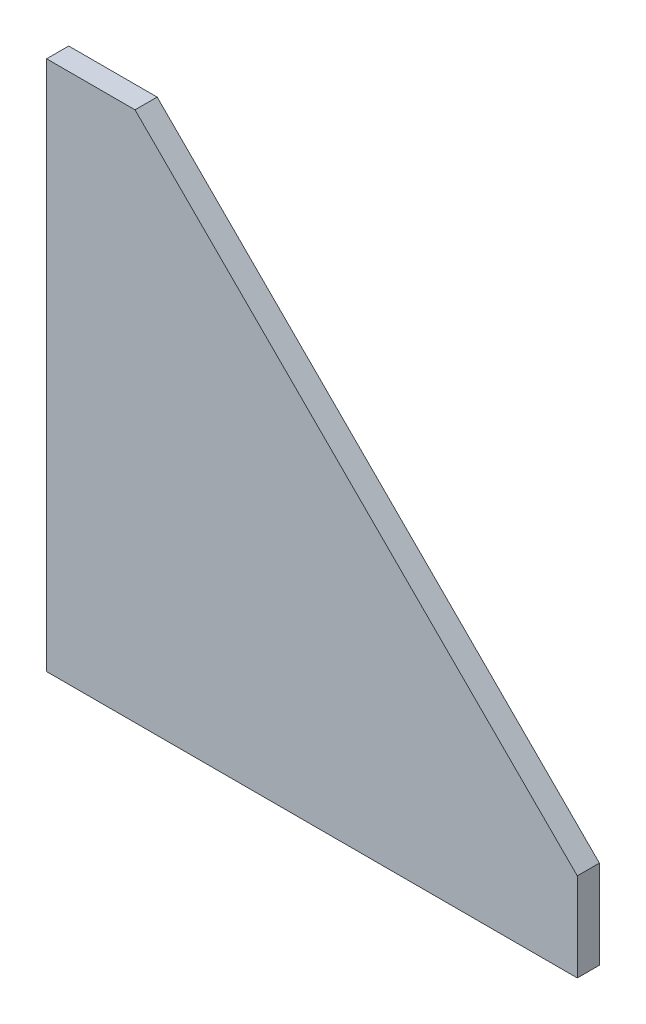
ISO-10303-21;
HEADER;
FILE_DESCRIPTION(('STEP AP214'),'2;1');
FILE_NAME('part.step','',(''),(''),'','','');
FILE_SCHEMA(('AUTOMOTIVE_DESIGN { 1 0 10303 214 1 1 1 1 }'));
ENDSEC;
DATA;
#1=APPLICATION_CONTEXT('core data for automotive mechanical design processes');
#2=APPLICATION_PROTOCOL_DEFINITION('international standard','automotive_design',2000,#1);
#3=PRODUCT_CONTEXT('',#1,'mechanical');
#4=PRODUCT('Part','Part','',(#3));
#5=PRODUCT_RELATED_PRODUCT_CATEGORY('part','',(#4));
#6=PRODUCT_DEFINITION_FORMATION('','',#4);
#7=PRODUCT_DEFINITION_CONTEXT('part definition',#1,'design');
#8=PRODUCT_DEFINITION('design','',#6,#7);
#9=PRODUCT_DEFINITION_SHAPE('','',#8);
#10=(LENGTH_UNIT() NAMED_UNIT(*) SI_UNIT(.MILLI.,.METRE.));
#11=(NAMED_UNIT(*) PLANE_ANGLE_UNIT() SI_UNIT($,.RADIAN.));
#12=(NAMED_UNIT(*) SI_UNIT($,.STERADIAN.) SOLID_ANGLE_UNIT());
#13=UNCERTAINTY_MEASURE_WITH_UNIT(LENGTH_MEASURE(1.E-05),#10,'distance_accuracy_value','');
#14=(GEOMETRIC_REPRESENTATION_CONTEXT(3) GLOBAL_UNCERTAINTY_ASSIGNED_CONTEXT((#13)) GLOBAL_UNIT_ASSIGNED_CONTEXT((#10,
#11,#12)) REPRESENTATION_CONTEXT('',''));
#15=CARTESIAN_POINT('',(0.,0.,0.));
#16=DIRECTION('',(0.,0.,1.));
#17=DIRECTION('',(1.,0.,0.));
#18=AXIS2_PLACEMENT_3D('',#15,#16,#17);
#19=CARTESIAN_POINT('',(304.8,0.,12.7));
#20=DIRECTION('',(0.,1.,0.));
#21=DIRECTION('',(-1.,0.,0.));
#22=AXIS2_PLACEMENT_3D('',#19,#20,#21);
#23=PLANE('',#22);
#24=DIRECTION('',(1.,0.,0.));
#25=VECTOR('',#24,1.);
#26=CARTESIAN_POINT('',(304.8,0.,0.));
#27=LINE('',#26,#25);
#28=CARTESIAN_POINT('',(0.,0.,0.));
#29=VERTEX_POINT('',#28);
#30=CARTESIAN_POINT('',(304.8,0.,0.));
#31=VERTEX_POINT('',#30);
#32=EDGE_CURVE('E107',#29,#31,#27,.T.);
#33=ORIENTED_EDGE('',*,*,#32,.T.);
#34=DIRECTION('',(0.,0.,-1.));
#35=VECTOR('',#34,1.);
#36=CARTESIAN_POINT('',(304.8,0.,12.7));
#37=LINE('',#36,#35);
#38=CARTESIAN_POINT('',(304.8,0.,12.7));
#39=VERTEX_POINT('',#38);
#40=EDGE_CURVE('E11',#39,#31,#37,.T.);
#41=ORIENTED_EDGE('',*,*,#40,.F.);
#42=DIRECTION('',(1.,0.,0.));
#43=VECTOR('',#42,1.);
#44=CARTESIAN_POINT('',(304.8,0.,12.7));
#45=LINE('',#44,#43);
#46=CARTESIAN_POINT('',(0.,0.,12.7));
#47=VERTEX_POINT('',#46);
#48=EDGE_CURVE('E115',#47,#39,#45,.T.);
#49=ORIENTED_EDGE('',*,*,#48,.F.);
#50=DIRECTION('',(0.,0.,-1.));
#51=VECTOR('',#50,1.);
#52=CARTESIAN_POINT('',(0.,0.,12.7));
#53=LINE('',#52,#51);
#54=EDGE_CURVE('E103',#47,#29,#53,.T.);
#55=ORIENTED_EDGE('',*,*,#54,.T.);
#56=EDGE_LOOP('',(#33,#41,#49,#55));
#57=FACE_BOUND('',#56,.T.);
#58=ADVANCED_FACE('F33',(#57),#23,.F.);
#59=CARTESIAN_POINT('',(304.8,50.8,12.7));
#60=DIRECTION('',(-1.,0.,0.));
#61=DIRECTION('',(0.,0.,1.));
#62=AXIS2_PLACEMENT_3D('',#59,#60,#61);
#63=PLANE('',#62);
#64=DIRECTION('',(0.,1.,0.));
#65=VECTOR('',#64,1.);
#66=CARTESIAN_POINT('',(304.8,50.8,0.));
#67=LINE('',#66,#65);
#68=CARTESIAN_POINT('',(304.8,50.8,0.));
#69=VERTEX_POINT('',#68);
#70=EDGE_CURVE('E110',#31,#69,#67,.T.);
#71=ORIENTED_EDGE('',*,*,#70,.T.);
#72=DIRECTION('',(0.,0.,-1.));
#73=VECTOR('',#72,1.);
#74=CARTESIAN_POINT('',(304.8,50.8,12.7));
#75=LINE('',#74,#73);
#76=CARTESIAN_POINT('',(304.8,50.8,12.7));
#77=VERTEX_POINT('',#76);
#78=EDGE_CURVE('E41',#77,#69,#75,.T.);
#79=ORIENTED_EDGE('',*,*,#78,.F.);
#80=DIRECTION('',(0.,1.,0.));
#81=VECTOR('',#80,1.);
#82=CARTESIAN_POINT('',(304.8,50.8,12.7));
#83=LINE('',#82,#81);
#84=EDGE_CURVE('E83',#39,#77,#83,.T.);
#85=ORIENTED_EDGE('',*,*,#84,.F.);
#86=ORIENTED_EDGE('',*,*,#40,.T.);
#87=EDGE_LOOP('',(#71,#79,#85,#86));
#88=FACE_BOUND('',#87,.T.);
#89=ADVANCED_FACE('F134',(#88),#63,.F.);
#90=CARTESIAN_POINT('',(50.8,304.8,12.7));
#91=DIRECTION('',(-0.707106781186548,-0.707106781186548,0.));
#92=DIRECTION('',(0.707106781186548,-0.707106781186548,0.));
#93=AXIS2_PLACEMENT_3D('',#90,#91,#92);
#94=PLANE('',#93);
#95=DIRECTION('',(-0.707106781186547,0.707106781186547,0.));
#96=VECTOR('',#95,1.);
#97=CARTESIAN_POINT('',(50.8,304.8,0.));
#98=LINE('',#97,#96);
#99=CARTESIAN_POINT('',(50.8,304.8,0.));
#100=VERTEX_POINT('',#99);
#101=EDGE_CURVE('E98',#69,#100,#98,.T.);
#102=ORIENTED_EDGE('',*,*,#101,.T.);
#103=DIRECTION('',(0.,0.,-1.));
#104=VECTOR('',#103,1.);
#105=CARTESIAN_POINT('',(50.8,304.8,12.7));
#106=LINE('',#105,#104);
#107=CARTESIAN_POINT('',(50.8,304.8,12.7));
#108=VERTEX_POINT('',#107);
#109=EDGE_CURVE('E95',#108,#100,#106,.T.);
#110=ORIENTED_EDGE('',*,*,#109,.F.);
#111=DIRECTION('',(-0.707106781186547,0.707106781186547,0.));
#112=VECTOR('',#111,1.);
#113=CARTESIAN_POINT('',(50.8,304.8,12.7));
#114=LINE('',#113,#112);
#115=EDGE_CURVE('E87',#77,#108,#114,.T.);
#116=ORIENTED_EDGE('',*,*,#115,.F.);
#117=ORIENTED_EDGE('',*,*,#78,.T.);
#118=EDGE_LOOP('',(#102,#110,#116,#117));
#119=FACE_BOUND('',#118,.T.);
#120=ADVANCED_FACE('F96',(#119),#94,.F.);
#121=CARTESIAN_POINT('',(0.,304.8,12.7));
#122=DIRECTION('',(0.,-1.,0.));
#123=DIRECTION('',(0.,0.,-1.));
#124=AXIS2_PLACEMENT_3D('',#121,#122,#123);
#125=PLANE('',#124);
#126=DIRECTION('',(-1.,0.,0.));
#127=VECTOR('',#126,1.);
#128=CARTESIAN_POINT('',(0.,304.8,0.));
#129=LINE('',#128,#127);
#130=CARTESIAN_POINT('',(0.,304.8,0.));
#131=VERTEX_POINT('',#130);
#132=EDGE_CURVE('E69',#100,#131,#129,.T.);
#133=ORIENTED_EDGE('',*,*,#132,.T.);
#134=DIRECTION('',(0.,0.,-1.));
#135=VECTOR('',#134,1.);
#136=CARTESIAN_POINT('',(0.,304.8,12.7));
#137=LINE('',#136,#135);
#138=CARTESIAN_POINT('',(0.,304.8,12.7));
#139=VERTEX_POINT('',#138);
#140=EDGE_CURVE('E99',#139,#131,#137,.T.);
#141=ORIENTED_EDGE('',*,*,#140,.F.);
#142=DIRECTION('',(-1.,0.,0.));
#143=VECTOR('',#142,1.);
#144=CARTESIAN_POINT('',(0.,304.8,12.7));
#145=LINE('',#144,#143);
#146=EDGE_CURVE('E91',#108,#139,#145,.T.);
#147=ORIENTED_EDGE('',*,*,#146,.F.);
#148=ORIENTED_EDGE('',*,*,#109,.T.);
#149=EDGE_LOOP('',(#133,#141,#147,#148));
#150=FACE_BOUND('',#149,.T.);
#151=ADVANCED_FACE('F101',(#150),#125,.F.);
#152=CARTESIAN_POINT('',(0.,0.,12.7));
#153=DIRECTION('',(1.,0.,0.));
#154=DIRECTION('',(0.,0.,-1.));
#155=AXIS2_PLACEMENT_3D('',#152,#153,#154);
#156=PLANE('',#155);
#157=DIRECTION('',(0.,-1.,0.));
#158=VECTOR('',#157,1.);
#159=CARTESIAN_POINT('',(0.,0.,0.));
#160=LINE('',#159,#158);
#161=EDGE_CURVE('E75',#131,#29,#160,.T.);
#162=ORIENTED_EDGE('',*,*,#161,.T.);
#163=ORIENTED_EDGE('',*,*,#54,.F.);
#164=DIRECTION('',(0.,-1.,0.));
#165=VECTOR('',#164,1.);
#166=CARTESIAN_POINT('',(0.,0.,12.7));
#167=LINE('',#166,#165);
#168=EDGE_CURVE('E49',#139,#47,#167,.T.);
#169=ORIENTED_EDGE('',*,*,#168,.F.);
#170=ORIENTED_EDGE('',*,*,#140,.T.);
#171=EDGE_LOOP('',(#162,#163,#169,#170));
#172=FACE_BOUND('',#171,.T.);
#173=ADVANCED_FACE('F123',(#172),#156,.F.);
#174=CARTESIAN_POINT('',(0.,0.,12.7));
#175=DIRECTION('',(0.,0.,-1.));
#176=DIRECTION('',(-1.,0.,0.));
#177=AXIS2_PLACEMENT_3D('',#174,#175,#176);
#178=PLANE('',#177);
#179=ORIENTED_EDGE('',*,*,#48,.T.);
#180=ORIENTED_EDGE('',*,*,#84,.T.);
#181=ORIENTED_EDGE('',*,*,#115,.T.);
#182=ORIENTED_EDGE('',*,*,#146,.T.);
#183=ORIENTED_EDGE('',*,*,#168,.T.);
#184=EDGE_LOOP('',(#179,#180,#181,#182,#183));
#185=FACE_BOUND('',#184,.T.);
#186=ADVANCED_FACE('F89',(#185),#178,.F.);
#187=CARTESIAN_POINT('',(0.,0.,0.));
#188=DIRECTION('',(0.,0.,-1.));
#189=DIRECTION('',(-1.,0.,0.));
#190=AXIS2_PLACEMENT_3D('',#187,#188,#189);
#191=PLANE('',#190);
#192=ORIENTED_EDGE('',*,*,#32,.F.);
#193=ORIENTED_EDGE('',*,*,#161,.F.);
#194=ORIENTED_EDGE('',*,*,#132,.F.);
#195=ORIENTED_EDGE('',*,*,#101,.F.);
#196=ORIENTED_EDGE('',*,*,#70,.F.);
#197=EDGE_LOOP('',(#192,#193,#194,#195,#196));
#198=FACE_BOUND('',#197,.T.);
#199=ADVANCED_FACE('F119',(#198),#191,.T.);
#200=CLOSED_SHELL('',(#58,#89,#120,#151,#173,#186,#199));
#201=MANIFOLD_SOLID_BREP('B2',#200);
#202=ADVANCED_BREP_SHAPE_REPRESENTATION('',(#18,#201),#14);
#203=SHAPE_DEFINITION_REPRESENTATION(#9,#202);
ENDSEC;
END-ISO-10303-21;
